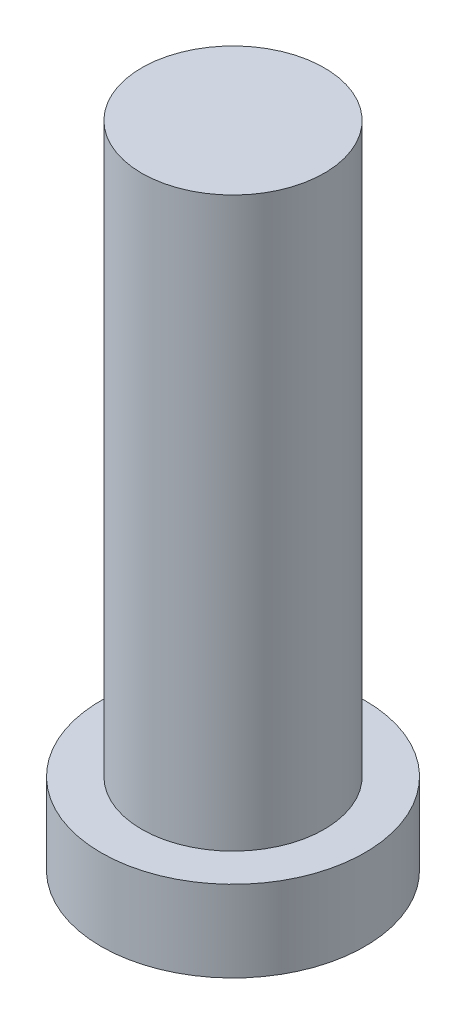
ISO-10303-21;
HEADER;
FILE_DESCRIPTION(('STEP AP214'),'2;1');
FILE_NAME('part.step','',(''),(''),'','','');
FILE_SCHEMA(('AUTOMOTIVE_DESIGN { 1 0 10303 214 1 1 1 1 }'));
ENDSEC;
DATA;
#1=APPLICATION_CONTEXT('core data for automotive mechanical design processes');
#2=APPLICATION_PROTOCOL_DEFINITION('international standard','automotive_design',2000,#1);
#3=PRODUCT_CONTEXT('',#1,'mechanical');
#4=PRODUCT('Part','Part','',(#3));
#5=PRODUCT_RELATED_PRODUCT_CATEGORY('part','',(#4));
#6=PRODUCT_DEFINITION_FORMATION('','',#4);
#7=PRODUCT_DEFINITION_CONTEXT('part definition',#1,'design');
#8=PRODUCT_DEFINITION('design','',#6,#7);
#9=PRODUCT_DEFINITION_SHAPE('','',#8);
#10=(LENGTH_UNIT() NAMED_UNIT(*) SI_UNIT(.MILLI.,.METRE.));
#11=(NAMED_UNIT(*) PLANE_ANGLE_UNIT() SI_UNIT($,.RADIAN.));
#12=(NAMED_UNIT(*) SI_UNIT($,.STERADIAN.) SOLID_ANGLE_UNIT());
#13=UNCERTAINTY_MEASURE_WITH_UNIT(LENGTH_MEASURE(1.E-05),#10,'distance_accuracy_value','');
#14=(GEOMETRIC_REPRESENTATION_CONTEXT(3) GLOBAL_UNCERTAINTY_ASSIGNED_CONTEXT((#13)) GLOBAL_UNIT_ASSIGNED_CONTEXT((#10,
#11,#12)) REPRESENTATION_CONTEXT('',''));
#15=CARTESIAN_POINT('',(0.,0.,0.));
#16=DIRECTION('',(0.,0.,1.));
#17=DIRECTION('',(1.,0.,0.));
#18=AXIS2_PLACEMENT_3D('',#15,#16,#17);
#19=CARTESIAN_POINT('',(0.,14.,0.));
#20=DIRECTION('',(0.,-1.,0.));
#21=DIRECTION('',(0.,0.,-1.));
#22=AXIS2_PLACEMENT_3D('',#19,#20,#21);
#23=CYLINDRICAL_SURFACE('',#22,2.25);
#24=CARTESIAN_POINT('',(0.,14.,0.));
#25=DIRECTION('',(0.,1.,0.));
#26=DIRECTION('',(0.,0.,1.));
#27=AXIS2_PLACEMENT_3D('',#24,#25,#26);
#28=CIRCLE('',#27,2.25);
#29=CARTESIAN_POINT('',(0.,14.,2.25));
#30=VERTEX_POINT('',#29);
#31=EDGE_CURVE('E10',#30,#30,#28,.T.);
#32=ORIENTED_EDGE('',*,*,#31,.F.);
#33=EDGE_LOOP('',(#32));
#34=FACE_BOUND('',#33,.T.);
#35=CARTESIAN_POINT('',(0.,0.,0.));
#36=DIRECTION('',(0.,1.,0.));
#37=DIRECTION('',(0.,0.,1.));
#38=AXIS2_PLACEMENT_3D('',#35,#36,#37);
#39=CIRCLE('',#38,2.25);
#40=CARTESIAN_POINT('',(0.,0.,2.25));
#41=VERTEX_POINT('',#40);
#42=EDGE_CURVE('E46',#41,#41,#39,.T.);
#43=ORIENTED_EDGE('',*,*,#42,.T.);
#44=EDGE_LOOP('',(#43));
#45=FACE_BOUND('',#44,.T.);
#46=ADVANCED_FACE('F43',(#34,#45),#23,.T.);
#47=CARTESIAN_POINT('',(0.,14.,0.));
#48=DIRECTION('',(0.,1.,0.));
#49=DIRECTION('',(0.,0.,1.));
#50=AXIS2_PLACEMENT_3D('',#47,#48,#49);
#51=PLANE('',#50);
#52=ORIENTED_EDGE('',*,*,#31,.T.);
#53=EDGE_LOOP('',(#52));
#54=FACE_BOUND('',#53,.T.);
#55=ADVANCED_FACE('F78',(#54),#51,.T.);
#56=CARTESIAN_POINT('',(0.,-2.,0.));
#57=DIRECTION('',(0.,1.,0.));
#58=DIRECTION('',(0.,0.,1.));
#59=AXIS2_PLACEMENT_3D('',#56,#57,#58);
#60=CYLINDRICAL_SURFACE('',#59,3.25);
#61=CARTESIAN_POINT('',(0.,-2.,0.));
#62=DIRECTION('',(0.,1.,0.));
#63=DIRECTION('',(0.,0.,1.));
#64=AXIS2_PLACEMENT_3D('',#61,#62,#63);
#65=CIRCLE('',#64,3.25);
#66=CARTESIAN_POINT('',(0.,-2.,3.25));
#67=VERTEX_POINT('',#66);
#68=EDGE_CURVE('E55',#67,#67,#65,.T.);
#69=ORIENTED_EDGE('',*,*,#68,.T.);
#70=EDGE_LOOP('',(#69));
#71=FACE_BOUND('',#70,.T.);
#72=CARTESIAN_POINT('',(0.,0.,0.));
#73=DIRECTION('',(0.,1.,0.));
#74=DIRECTION('',(0.,0.,1.));
#75=AXIS2_PLACEMENT_3D('',#72,#73,#74);
#76=CIRCLE('',#75,3.25);
#77=CARTESIAN_POINT('',(0.,0.,3.25));
#78=VERTEX_POINT('',#77);
#79=EDGE_CURVE('E57',#78,#78,#76,.T.);
#80=ORIENTED_EDGE('',*,*,#79,.F.);
#81=EDGE_LOOP('',(#80));
#82=FACE_BOUND('',#81,.T.);
#83=ADVANCED_FACE('F65',(#71,#82),#60,.T.);
#84=CARTESIAN_POINT('',(0.,-2.,0.));
#85=DIRECTION('',(0.,1.,0.));
#86=DIRECTION('',(0.,0.,1.));
#87=AXIS2_PLACEMENT_3D('',#84,#85,#86);
#88=PLANE('',#87);
#89=ORIENTED_EDGE('',*,*,#68,.F.);
#90=EDGE_LOOP('',(#89));
#91=FACE_BOUND('',#90,.T.);
#92=ADVANCED_FACE('F68',(#91),#88,.F.);
#93=CARTESIAN_POINT('',(0.,0.,0.));
#94=DIRECTION('',(0.,1.,0.));
#95=DIRECTION('',(0.,0.,1.));
#96=AXIS2_PLACEMENT_3D('',#93,#94,#95);
#97=PLANE('',#96);
#98=ORIENTED_EDGE('',*,*,#42,.F.);
#99=EDGE_LOOP('',(#98));
#100=FACE_BOUND('',#99,.T.);
#101=ORIENTED_EDGE('',*,*,#79,.T.);
#102=EDGE_LOOP('',(#101));
#103=FACE_BOUND('',#102,.T.);
#104=ADVANCED_FACE('F70',(#100,#103),#97,.T.);
#105=CLOSED_SHELL('',(#46,#55,#83,#92,#104));
#106=MANIFOLD_SOLID_BREP('B2',#105);
#107=ADVANCED_BREP_SHAPE_REPRESENTATION('',(#18,#106),#14);
#108=SHAPE_DEFINITION_REPRESENTATION(#9,#107);
ENDSEC;
END-ISO-10303-21;
